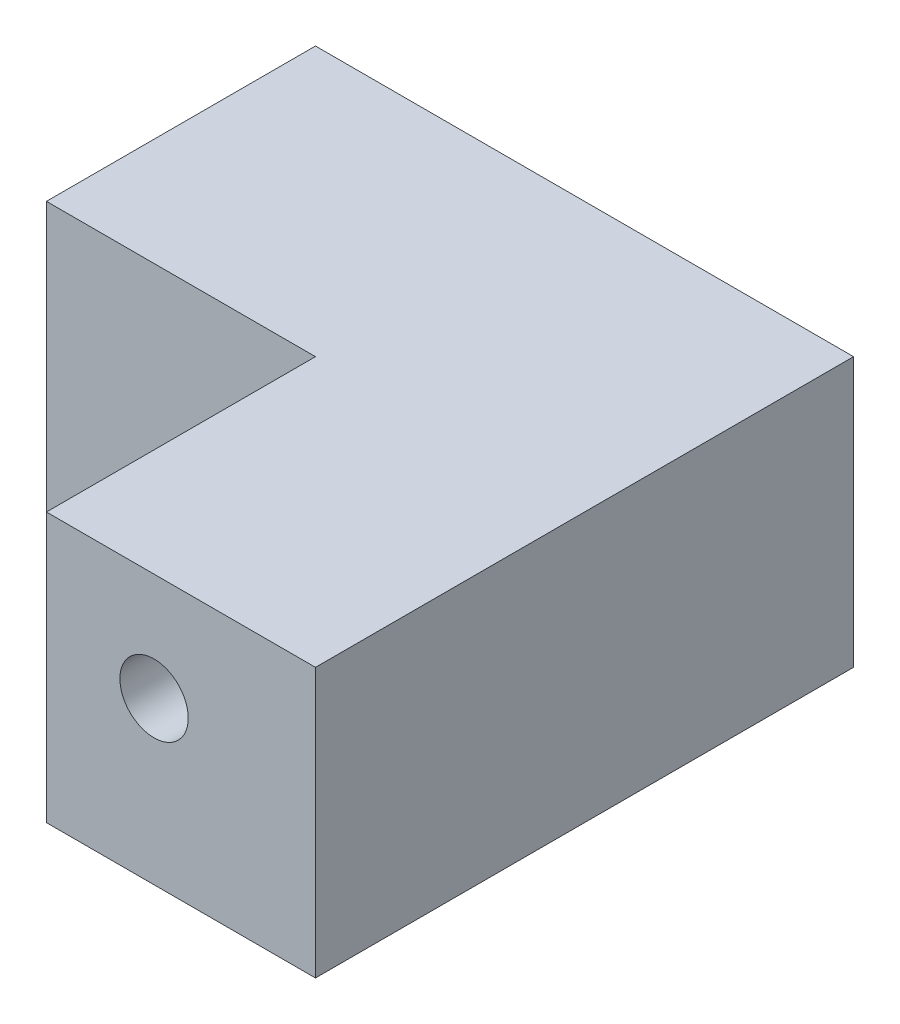
ISO-10303-21;
HEADER;
FILE_DESCRIPTION(('STEP AP214'),'2;1');
FILE_NAME('part.step','',(''),(''),'','','');
FILE_SCHEMA(('AUTOMOTIVE_DESIGN { 1 0 10303 214 1 1 1 1 }'));
ENDSEC;
DATA;
#1=APPLICATION_CONTEXT('core data for automotive mechanical design processes');
#2=APPLICATION_PROTOCOL_DEFINITION('international standard','automotive_design',2000,#1);
#3=PRODUCT_CONTEXT('',#1,'mechanical');
#4=PRODUCT('Part','Part','',(#3));
#5=PRODUCT_RELATED_PRODUCT_CATEGORY('part','',(#4));
#6=PRODUCT_DEFINITION_FORMATION('','',#4);
#7=PRODUCT_DEFINITION_CONTEXT('part definition',#1,'design');
#8=PRODUCT_DEFINITION('design','',#6,#7);
#9=PRODUCT_DEFINITION_SHAPE('','',#8);
#10=(LENGTH_UNIT() NAMED_UNIT(*) SI_UNIT(.MILLI.,.METRE.));
#11=(NAMED_UNIT(*) PLANE_ANGLE_UNIT() SI_UNIT($,.RADIAN.));
#12=(NAMED_UNIT(*) SI_UNIT($,.STERADIAN.) SOLID_ANGLE_UNIT());
#13=UNCERTAINTY_MEASURE_WITH_UNIT(LENGTH_MEASURE(1.E-05),#10,'distance_accuracy_value','');
#14=(GEOMETRIC_REPRESENTATION_CONTEXT(3) GLOBAL_UNCERTAINTY_ASSIGNED_CONTEXT((#13)) GLOBAL_UNIT_ASSIGNED_CONTEXT((#10,
#11,#12)) REPRESENTATION_CONTEXT('',''));
#15=CARTESIAN_POINT('',(0.,0.,0.));
#16=DIRECTION('',(0.,0.,1.));
#17=DIRECTION('',(1.,0.,0.));
#18=AXIS2_PLACEMENT_3D('',#15,#16,#17);
#19=CARTESIAN_POINT('',(150.,25.,-150.));
#20=DIRECTION('',(0.,0.,-1.));
#21=DIRECTION('',(1.,0.,0.));
#22=AXIS2_PLACEMENT_3D('',#19,#20,#21);
#23=PLANE('',#22);
#24=DIRECTION('',(-1.,0.,0.));
#25=VECTOR('',#24,1.);
#26=CARTESIAN_POINT('',(150.,0.,-150.));
#27=LINE('',#26,#25);
#28=CARTESIAN_POINT('',(150.,0.,-150.));
#29=VERTEX_POINT('',#28);
#30=CARTESIAN_POINT('',(125.,0.,-150.));
#31=VERTEX_POINT('',#30);
#32=EDGE_CURVE('E118',#29,#31,#27,.T.);
#33=ORIENTED_EDGE('',*,*,#32,.F.);
#34=DIRECTION('',(0.,-1.,0.));
#35=VECTOR('',#34,1.);
#36=CARTESIAN_POINT('',(150.,25.,-150.));
#37=LINE('',#36,#35);
#38=CARTESIAN_POINT('',(150.,25.,-150.));
#39=VERTEX_POINT('',#38);
#40=EDGE_CURVE('E117',#39,#29,#37,.T.);
#41=ORIENTED_EDGE('',*,*,#40,.F.);
#42=DIRECTION('',(-1.,0.,0.));
#43=VECTOR('',#42,1.);
#44=CARTESIAN_POINT('',(150.,25.,-150.));
#45=LINE('',#44,#43);
#46=CARTESIAN_POINT('',(125.,25.,-150.));
#47=VERTEX_POINT('',#46);
#48=EDGE_CURVE('E130',#39,#47,#45,.T.);
#49=ORIENTED_EDGE('',*,*,#48,.T.);
#50=DIRECTION('',(0.,-1.,0.));
#51=VECTOR('',#50,1.);
#52=CARTESIAN_POINT('',(125.,25.,-150.));
#53=LINE('',#52,#51);
#54=EDGE_CURVE('E12',#47,#31,#53,.T.);
#55=ORIENTED_EDGE('',*,*,#54,.T.);
#56=EDGE_LOOP('',(#33,#41,#49,#55));
#57=FACE_BOUND('',#56,.T.);
#58=ADVANCED_FACE('F34',(#57),#23,.F.);
#59=CARTESIAN_POINT('',(125.,25.,-150.));
#60=DIRECTION('',(1.,0.,0.));
#61=DIRECTION('',(0.,0.,1.));
#62=AXIS2_PLACEMENT_3D('',#59,#60,#61);
#63=PLANE('',#62);
#64=CARTESIAN_POINT('',(125.,15.,-160.));
#65=DIRECTION('',(-1.,0.,0.));
#66=DIRECTION('',(0.,0.,1.));
#67=AXIS2_PLACEMENT_3D('',#64,#65,#66);
#68=CIRCLE('',#67,3.175);
#69=CARTESIAN_POINT('',(125.,15.,-156.825));
#70=VERTEX_POINT('',#69);
#71=EDGE_CURVE('E152',#70,#70,#68,.T.);
#72=ORIENTED_EDGE('',*,*,#71,.F.);
#73=EDGE_LOOP('',(#72));
#74=FACE_BOUND('',#73,.T.);
#75=DIRECTION('',(0.,0.,-1.));
#76=VECTOR('',#75,1.);
#77=CARTESIAN_POINT('',(125.,0.,-150.));
#78=LINE('',#77,#76);
#79=CARTESIAN_POINT('',(125.,0.,-175.));
#80=VERTEX_POINT('',#79);
#81=EDGE_CURVE('E120',#31,#80,#78,.T.);
#82=ORIENTED_EDGE('',*,*,#81,.F.);
#83=ORIENTED_EDGE('',*,*,#54,.F.);
#84=DIRECTION('',(0.,0.,-1.));
#85=VECTOR('',#84,1.);
#86=CARTESIAN_POINT('',(125.,25.,-150.));
#87=LINE('',#86,#85);
#88=CARTESIAN_POINT('',(125.,25.,-175.));
#89=VERTEX_POINT('',#88);
#90=EDGE_CURVE('E83',#47,#89,#87,.T.);
#91=ORIENTED_EDGE('',*,*,#90,.T.);
#92=DIRECTION('',(0.,-1.,0.));
#93=VECTOR('',#92,1.);
#94=CARTESIAN_POINT('',(125.,25.,-175.));
#95=LINE('',#94,#93);
#96=EDGE_CURVE('E43',#89,#80,#95,.T.);
#97=ORIENTED_EDGE('',*,*,#96,.T.);
#98=EDGE_LOOP('',(#82,#83,#91,#97));
#99=FACE_BOUND('',#98,.T.);
#100=ADVANCED_FACE('F137',(#74,#99),#63,.F.);
#101=CARTESIAN_POINT('',(125.,25.,-175.));
#102=DIRECTION('',(0.,0.,1.));
#103=DIRECTION('',(-1.,0.,0.));
#104=AXIS2_PLACEMENT_3D('',#101,#102,#103);
#105=PLANE('',#104);
#106=DIRECTION('',(1.,0.,0.));
#107=VECTOR('',#106,1.);
#108=CARTESIAN_POINT('',(125.,0.,-175.));
#109=LINE('',#108,#107);
#110=CARTESIAN_POINT('',(175.,0.,-175.));
#111=VERTEX_POINT('',#110);
#112=EDGE_CURVE('E123',#80,#111,#109,.T.);
#113=ORIENTED_EDGE('',*,*,#112,.F.);
#114=ORIENTED_EDGE('',*,*,#96,.F.);
#115=DIRECTION('',(1.,0.,0.));
#116=VECTOR('',#115,1.);
#117=CARTESIAN_POINT('',(125.,25.,-175.));
#118=LINE('',#117,#116);
#119=CARTESIAN_POINT('',(175.,25.,-175.));
#120=VERTEX_POINT('',#119);
#121=EDGE_CURVE('E111',#89,#120,#118,.T.);
#122=ORIENTED_EDGE('',*,*,#121,.T.);
#123=DIRECTION('',(0.,-1.,0.));
#124=VECTOR('',#123,1.);
#125=CARTESIAN_POINT('',(175.,25.,-175.));
#126=LINE('',#125,#124);
#127=EDGE_CURVE('E105',#120,#111,#126,.T.);
#128=ORIENTED_EDGE('',*,*,#127,.T.);
#129=EDGE_LOOP('',(#113,#114,#122,#128));
#130=FACE_BOUND('',#129,.T.);
#131=ADVANCED_FACE('F159',(#130),#105,.F.);
#132=CARTESIAN_POINT('',(175.,25.,-175.));
#133=DIRECTION('',(-1.,0.,0.));
#134=DIRECTION('',(0.,0.,-1.));
#135=AXIS2_PLACEMENT_3D('',#132,#133,#134);
#136=PLANE('',#135);
#137=DIRECTION('',(0.,0.,1.));
#138=VECTOR('',#137,1.);
#139=CARTESIAN_POINT('',(175.,0.,-175.));
#140=LINE('',#139,#138);
#141=CARTESIAN_POINT('',(175.,0.,-125.));
#142=VERTEX_POINT('',#141);
#143=EDGE_CURVE('E126',#111,#142,#140,.T.);
#144=ORIENTED_EDGE('',*,*,#143,.F.);
#145=ORIENTED_EDGE('',*,*,#127,.F.);
#146=DIRECTION('',(0.,0.,1.));
#147=VECTOR('',#146,1.);
#148=CARTESIAN_POINT('',(175.,25.,-175.));
#149=LINE('',#148,#147);
#150=CARTESIAN_POINT('',(175.,25.,-125.));
#151=VERTEX_POINT('',#150);
#152=EDGE_CURVE('E95',#120,#151,#149,.T.);
#153=ORIENTED_EDGE('',*,*,#152,.T.);
#154=DIRECTION('',(0.,-1.,0.));
#155=VECTOR('',#154,1.);
#156=CARTESIAN_POINT('',(175.,25.,-125.));
#157=LINE('',#156,#155);
#158=EDGE_CURVE('E100',#151,#142,#157,.T.);
#159=ORIENTED_EDGE('',*,*,#158,.T.);
#160=EDGE_LOOP('',(#144,#145,#153,#159));
#161=FACE_BOUND('',#160,.T.);
#162=ADVANCED_FACE('F108',(#161),#136,.F.);
#163=CARTESIAN_POINT('',(175.,25.,-125.));
#164=DIRECTION('',(0.,0.,-1.));
#165=DIRECTION('',(1.,0.,0.));
#166=AXIS2_PLACEMENT_3D('',#163,#164,#165);
#167=PLANE('',#166);
#168=CARTESIAN_POINT('',(160.,15.,-125.));
#169=DIRECTION('',(0.,0.,1.));
#170=DIRECTION('',(1.,0.,0.));
#171=AXIS2_PLACEMENT_3D('',#168,#169,#170);
#172=CIRCLE('',#171,3.175);
#173=CARTESIAN_POINT('',(163.175,15.,-125.));
#174=VERTEX_POINT('',#173);
#175=EDGE_CURVE('E37',#174,#174,#172,.T.);
#176=ORIENTED_EDGE('',*,*,#175,.F.);
#177=EDGE_LOOP('',(#176));
#178=FACE_BOUND('',#177,.T.);
#179=DIRECTION('',(-1.,0.,0.));
#180=VECTOR('',#179,1.);
#181=CARTESIAN_POINT('',(175.,0.,-125.));
#182=LINE('',#181,#180);
#183=CARTESIAN_POINT('',(150.,0.,-125.));
#184=VERTEX_POINT('',#183);
#185=EDGE_CURVE('E102',#142,#184,#182,.T.);
#186=ORIENTED_EDGE('',*,*,#185,.F.);
#187=ORIENTED_EDGE('',*,*,#158,.F.);
#188=DIRECTION('',(-1.,0.,0.));
#189=VECTOR('',#188,1.);
#190=CARTESIAN_POINT('',(175.,25.,-125.));
#191=LINE('',#190,#189);
#192=CARTESIAN_POINT('',(150.,25.,-125.));
#193=VERTEX_POINT('',#192);
#194=EDGE_CURVE('E91',#151,#193,#191,.T.);
#195=ORIENTED_EDGE('',*,*,#194,.T.);
#196=DIRECTION('',(0.,-1.,0.));
#197=VECTOR('',#196,1.);
#198=CARTESIAN_POINT('',(150.,25.,-125.));
#199=LINE('',#198,#197);
#200=EDGE_CURVE('E106',#193,#184,#199,.T.);
#201=ORIENTED_EDGE('',*,*,#200,.T.);
#202=EDGE_LOOP('',(#186,#187,#195,#201));
#203=FACE_BOUND('',#202,.T.);
#204=ADVANCED_FACE('F101',(#178,#203),#167,.F.);
#205=CARTESIAN_POINT('',(150.,25.,-125.));
#206=DIRECTION('',(1.,0.,0.));
#207=DIRECTION('',(0.,0.,1.));
#208=AXIS2_PLACEMENT_3D('',#205,#206,#207);
#209=PLANE('',#208);
#210=DIRECTION('',(0.,0.,-1.));
#211=VECTOR('',#210,1.);
#212=CARTESIAN_POINT('',(150.,0.,-125.));
#213=LINE('',#212,#211);
#214=EDGE_CURVE('E71',#184,#29,#213,.T.);
#215=ORIENTED_EDGE('',*,*,#214,.F.);
#216=ORIENTED_EDGE('',*,*,#200,.F.);
#217=DIRECTION('',(0.,0.,-1.));
#218=VECTOR('',#217,1.);
#219=CARTESIAN_POINT('',(150.,25.,-125.));
#220=LINE('',#219,#218);
#221=EDGE_CURVE('E51',#193,#39,#220,.T.);
#222=ORIENTED_EDGE('',*,*,#221,.T.);
#223=ORIENTED_EDGE('',*,*,#40,.T.);
#224=EDGE_LOOP('',(#215,#216,#222,#223));
#225=FACE_BOUND('',#224,.T.);
#226=ADVANCED_FACE('F170',(#225),#209,.F.);
#227=CARTESIAN_POINT('',(0.,25.,0.));
#228=DIRECTION('',(0.,1.,0.));
#229=DIRECTION('',(0.,0.,1.));
#230=AXIS2_PLACEMENT_3D('',#227,#228,#229);
#231=PLANE('',#230);
#232=ORIENTED_EDGE('',*,*,#48,.F.);
#233=ORIENTED_EDGE('',*,*,#221,.F.);
#234=ORIENTED_EDGE('',*,*,#194,.F.);
#235=ORIENTED_EDGE('',*,*,#152,.F.);
#236=ORIENTED_EDGE('',*,*,#121,.F.);
#237=ORIENTED_EDGE('',*,*,#90,.F.);
#238=EDGE_LOOP('',(#232,#233,#234,#235,#236,#237));
#239=FACE_BOUND('',#238,.T.);
#240=ADVANCED_FACE('F93',(#239),#231,.T.);
#241=CARTESIAN_POINT('',(0.,0.,0.));
#242=DIRECTION('',(0.,1.,0.));
#243=DIRECTION('',(0.,0.,1.));
#244=AXIS2_PLACEMENT_3D('',#241,#242,#243);
#245=PLANE('',#244);
#246=ORIENTED_EDGE('',*,*,#32,.T.);
#247=ORIENTED_EDGE('',*,*,#81,.T.);
#248=ORIENTED_EDGE('',*,*,#112,.T.);
#249=ORIENTED_EDGE('',*,*,#143,.T.);
#250=ORIENTED_EDGE('',*,*,#185,.T.);
#251=ORIENTED_EDGE('',*,*,#214,.T.);
#252=EDGE_LOOP('',(#246,#247,#248,#249,#250,#251));
#253=FACE_BOUND('',#252,.T.);
#254=ADVANCED_FACE('F139',(#253),#245,.F.);
#255=CARTESIAN_POINT('',(160.,15.,-153.980256121069));
#256=DIRECTION('',(0.,0.,1.));
#257=DIRECTION('',(-1.,0.,0.));
#258=AXIS2_PLACEMENT_3D('',#255,#256,#257);
#259=CYLINDRICAL_SURFACE('',#258,3.175);
#260=CARTESIAN_POINT('',(160.,15.,-135.));
#261=DIRECTION('',(0.,0.,1.));
#262=DIRECTION('',(1.,0.,0.));
#263=AXIS2_PLACEMENT_3D('',#260,#261,#262);
#264=CIRCLE('',#263,3.175);
#265=CARTESIAN_POINT('',(163.175,15.,-135.));
#266=VERTEX_POINT('',#265);
#267=EDGE_CURVE('E146',#266,#266,#264,.F.);
#268=ORIENTED_EDGE('',*,*,#267,.T.);
#269=EDGE_LOOP('',(#268));
#270=FACE_BOUND('',#269,.T.);
#271=ORIENTED_EDGE('',*,*,#175,.T.);
#272=EDGE_LOOP('',(#271));
#273=FACE_BOUND('',#272,.T.);
#274=ADVANCED_FACE('F176',(#270,#273),#259,.F.);
#275=CARTESIAN_POINT('',(175.,25.,-135.));
#276=DIRECTION('',(0.,0.,-1.));
#277=DIRECTION('',(1.,0.,0.));
#278=AXIS2_PLACEMENT_3D('',#275,#276,#277);
#279=PLANE('',#278);
#280=ORIENTED_EDGE('',*,*,#267,.F.);
#281=EDGE_LOOP('',(#280));
#282=FACE_BOUND('',#281,.T.);
#283=ADVANCED_FACE('F179',(#282),#279,.F.);
#284=CARTESIAN_POINT('',(153.980256121069,15.,-160.));
#285=DIRECTION('',(-1.,0.,0.));
#286=DIRECTION('',(0.,0.,-1.));
#287=AXIS2_PLACEMENT_3D('',#284,#285,#286);
#288=CYLINDRICAL_SURFACE('',#287,3.175);
#289=CARTESIAN_POINT('',(135.,15.,-160.));
#290=DIRECTION('',(-1.,0.,0.));
#291=DIRECTION('',(0.,0.,1.));
#292=AXIS2_PLACEMENT_3D('',#289,#290,#291);
#293=CIRCLE('',#292,3.175);
#294=CARTESIAN_POINT('',(135.,15.,-156.825));
#295=VERTEX_POINT('',#294);
#296=EDGE_CURVE('E149',#295,#295,#293,.F.);
#297=ORIENTED_EDGE('',*,*,#296,.T.);
#298=EDGE_LOOP('',(#297));
#299=FACE_BOUND('',#298,.T.);
#300=ORIENTED_EDGE('',*,*,#71,.T.);
#301=EDGE_LOOP('',(#300));
#302=FACE_BOUND('',#301,.T.);
#303=ADVANCED_FACE('F156',(#299,#302),#288,.F.);
#304=CARTESIAN_POINT('',(135.,25.,-145.));
#305=DIRECTION('',(1.,0.,0.));
#306=DIRECTION('',(0.,0.,1.));
#307=AXIS2_PLACEMENT_3D('',#304,#305,#306);
#308=PLANE('',#307);
#309=ORIENTED_EDGE('',*,*,#296,.F.);
#310=EDGE_LOOP('',(#309));
#311=FACE_BOUND('',#310,.T.);
#312=ADVANCED_FACE('F188',(#311),#308,.F.);
#313=CLOSED_SHELL('',(#58,#100,#131,#162,#204,#226,#240,#254,#274,#283,#303,#312));
#314=MANIFOLD_SOLID_BREP('B2',#313);
#315=ADVANCED_BREP_SHAPE_REPRESENTATION('',(#18,#314),#14);
#316=SHAPE_DEFINITION_REPRESENTATION(#9,#315);
ENDSEC;
END-ISO-10303-21;
